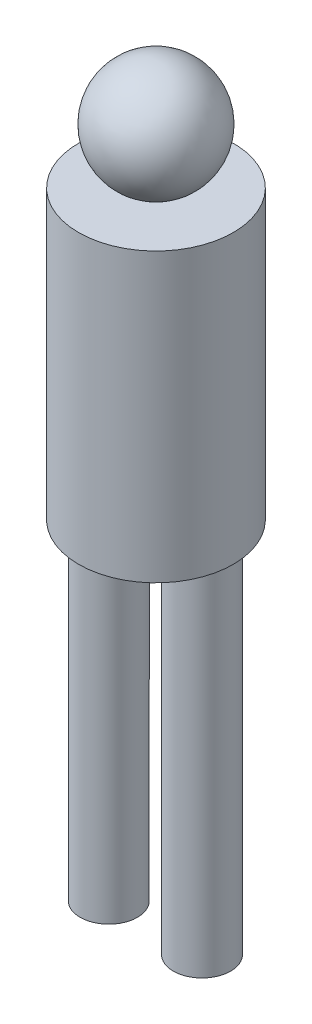
ISO-10303-21;
HEADER;
FILE_DESCRIPTION(('STEP AP214'),'2;1');
FILE_NAME('part.step','',(''),(''),'','','');
FILE_SCHEMA(('AUTOMOTIVE_DESIGN { 1 0 10303 214 1 1 1 1 }'));
ENDSEC;
DATA;
#1=APPLICATION_CONTEXT('core data for automotive mechanical design processes');
#2=APPLICATION_PROTOCOL_DEFINITION('international standard','automotive_design',2000,#1);
#3=PRODUCT_CONTEXT('',#1,'mechanical');
#4=PRODUCT('Part','Part','',(#3));
#5=PRODUCT_RELATED_PRODUCT_CATEGORY('part','',(#4));
#6=PRODUCT_DEFINITION_FORMATION('','',#4);
#7=PRODUCT_DEFINITION_CONTEXT('part definition',#1,'design');
#8=PRODUCT_DEFINITION('design','',#6,#7);
#9=PRODUCT_DEFINITION_SHAPE('','',#8);
#10=(LENGTH_UNIT() NAMED_UNIT(*) SI_UNIT(.MILLI.,.METRE.));
#11=(NAMED_UNIT(*) PLANE_ANGLE_UNIT() SI_UNIT($,.RADIAN.));
#12=(NAMED_UNIT(*) SI_UNIT($,.STERADIAN.) SOLID_ANGLE_UNIT());
#13=UNCERTAINTY_MEASURE_WITH_UNIT(LENGTH_MEASURE(1.E-05),#10,'distance_accuracy_value','');
#14=(GEOMETRIC_REPRESENTATION_CONTEXT(3) GLOBAL_UNCERTAINTY_ASSIGNED_CONTEXT((#13)) GLOBAL_UNIT_ASSIGNED_CONTEXT((#10,
#11,#12)) REPRESENTATION_CONTEXT('',''));
#15=CARTESIAN_POINT('',(0.,0.,0.));
#16=DIRECTION('',(0.,0.,1.));
#17=DIRECTION('',(1.,0.,0.));
#18=AXIS2_PLACEMENT_3D('',#15,#16,#17);
#19=CARTESIAN_POINT('',(0.,787.4,0.));
#20=DIRECTION('',(0.,-1.,0.));
#21=DIRECTION('',(0.,0.,1.));
#22=AXIS2_PLACEMENT_3D('',#19,#20,#21);
#23=SPHERICAL_SURFACE('',#22,127.);
#24=CARTESIAN_POINT('',(0.,660.4,0.));
#25=VERTEX_POINT('',#24);
#26=VERTEX_LOOP('',#25);
#27=FACE_BOUND('',#26,.T.);
#28=ADVANCED_FACE('F38',(#27),#23,.T.);
#29=CLOSED_SHELL('',(#28));
#30=MANIFOLD_SOLID_BREP('B2',#29);
#31=CARTESIAN_POINT('',(0.,0.,0.));
#32=DIRECTION('',(0.,1.,0.));
#33=DIRECTION('',(0.,0.,1.));
#34=AXIS2_PLACEMENT_3D('',#31,#32,#33);
#35=PLANE('',#34);
#36=CARTESIAN_POINT('',(-108.384656073321,0.,0.));
#37=DIRECTION('',(0.,1.,0.));
#38=DIRECTION('',(0.,0.,1.));
#39=AXIS2_PLACEMENT_3D('',#36,#37,#38);
#40=CIRCLE('',#39,65.8136172775828);
#41=CARTESIAN_POINT('',(-108.384656073321,0.,65.8136172775828));
#42=VERTEX_POINT('',#41);
#43=EDGE_CURVE('E57',#42,#42,#40,.F.);
#44=ORIENTED_EDGE('',*,*,#43,.F.);
#45=EDGE_LOOP('',(#44));
#46=FACE_BOUND('',#45,.T.);
#47=CARTESIAN_POINT('',(0.,0.,0.));
#48=DIRECTION('',(0.,1.,0.));
#49=DIRECTION('',(0.,0.,1.));
#50=AXIS2_PLACEMENT_3D('',#47,#48,#49);
#51=CIRCLE('',#50,177.8);
#52=CARTESIAN_POINT('',(0.,0.,177.8));
#53=VERTEX_POINT('',#52);
#54=EDGE_CURVE('E65',#53,#53,#51,.T.);
#55=ORIENTED_EDGE('',*,*,#54,.F.);
#56=EDGE_LOOP('',(#55));
#57=FACE_BOUND('',#56,.T.);
#58=CARTESIAN_POINT('',(105.835290588617,0.,0.));
#59=DIRECTION('',(0.,1.,0.));
#60=DIRECTION('',(0.,0.,1.));
#61=AXIS2_PLACEMENT_3D('',#58,#59,#60);
#62=CIRCLE('',#61,65.8136172775828);
#63=CARTESIAN_POINT('',(105.835290588617,0.,65.8136172775828));
#64=VERTEX_POINT('',#63);
#65=EDGE_CURVE('E37',#64,#64,#62,.F.);
#66=ORIENTED_EDGE('',*,*,#65,.F.);
#67=EDGE_LOOP('',(#66));
#68=FACE_BOUND('',#67,.T.);
#69=ADVANCED_FACE('F50',(#46,#57,#68),#35,.F.);
#70=CARTESIAN_POINT('',(0.,660.4,0.));
#71=DIRECTION('',(0.,-1.,0.));
#72=DIRECTION('',(0.,0.,-1.));
#73=AXIS2_PLACEMENT_3D('',#70,#71,#72);
#74=CYLINDRICAL_SURFACE('',#73,177.8);
#75=CARTESIAN_POINT('',(0.,660.4,0.));
#76=DIRECTION('',(0.,1.,0.));
#77=DIRECTION('',(0.,0.,1.));
#78=AXIS2_PLACEMENT_3D('',#75,#76,#77);
#79=CIRCLE('',#78,177.8);
#80=CARTESIAN_POINT('',(0.,660.4,177.8));
#81=VERTEX_POINT('',#80);
#82=EDGE_CURVE('E61',#81,#81,#79,.T.);
#83=ORIENTED_EDGE('',*,*,#82,.F.);
#84=EDGE_LOOP('',(#83));
#85=FACE_BOUND('',#84,.T.);
#86=ORIENTED_EDGE('',*,*,#54,.T.);
#87=EDGE_LOOP('',(#86));
#88=FACE_BOUND('',#87,.T.);
#89=ADVANCED_FACE('F52',(#85,#88),#74,.T.);
#90=CARTESIAN_POINT('',(0.,660.4,0.));
#91=DIRECTION('',(0.,1.,0.));
#92=DIRECTION('',(0.,0.,1.));
#93=AXIS2_PLACEMENT_3D('',#90,#91,#92);
#94=PLANE('',#93);
#95=ORIENTED_EDGE('',*,*,#82,.T.);
#96=EDGE_LOOP('',(#95));
#97=FACE_BOUND('',#96,.T.);
#98=ADVANCED_FACE('F96',(#97),#94,.T.);
#99=CARTESIAN_POINT('',(-108.384656073321,-812.8,0.));
#100=DIRECTION('',(0.,1.,0.));
#101=DIRECTION('',(0.,0.,1.));
#102=AXIS2_PLACEMENT_3D('',#99,#100,#101);
#103=CYLINDRICAL_SURFACE('',#102,65.8136172775828);
#104=CARTESIAN_POINT('',(-108.384656073321,-812.8,0.));
#105=DIRECTION('',(0.,-1.,0.));
#106=DIRECTION('',(0.,0.,-1.));
#107=AXIS2_PLACEMENT_3D('',#104,#105,#106);
#108=CIRCLE('',#107,65.8136172775828);
#109=CARTESIAN_POINT('',(-108.384656073321,-812.8,-65.8136172775828));
#110=VERTEX_POINT('',#109);
#111=EDGE_CURVE('E69',#110,#110,#108,.T.);
#112=ORIENTED_EDGE('',*,*,#111,.F.);
#113=EDGE_LOOP('',(#112));
#114=FACE_BOUND('',#113,.T.);
#115=ORIENTED_EDGE('',*,*,#43,.T.);
#116=EDGE_LOOP('',(#115));
#117=FACE_BOUND('',#116,.T.);
#118=ADVANCED_FACE('F88',(#114,#117),#103,.T.);
#119=CARTESIAN_POINT('',(-108.384656073321,-812.8,0.));
#120=DIRECTION('',(0.,-1.,0.));
#121=DIRECTION('',(0.,0.,-1.));
#122=AXIS2_PLACEMENT_3D('',#119,#120,#121);
#123=PLANE('',#122);
#124=ORIENTED_EDGE('',*,*,#111,.T.);
#125=EDGE_LOOP('',(#124));
#126=FACE_BOUND('',#125,.T.);
#127=ADVANCED_FACE('F81',(#126),#123,.T.);
#128=CARTESIAN_POINT('',(105.835290588617,-812.8,0.));
#129=DIRECTION('',(0.,1.,0.));
#130=DIRECTION('',(0.,0.,1.));
#131=AXIS2_PLACEMENT_3D('',#128,#129,#130);
#132=CYLINDRICAL_SURFACE('',#131,65.8136172775828);
#133=CARTESIAN_POINT('',(105.835290588617,-812.8,0.));
#134=DIRECTION('',(0.,-1.,0.));
#135=DIRECTION('',(0.,0.,-1.));
#136=AXIS2_PLACEMENT_3D('',#133,#134,#135);
#137=CIRCLE('',#136,65.8136172775828);
#138=CARTESIAN_POINT('',(105.835290588617,-812.8,-65.8136172775828));
#139=VERTEX_POINT('',#138);
#140=EDGE_CURVE('E73',#139,#139,#137,.T.);
#141=ORIENTED_EDGE('',*,*,#140,.F.);
#142=EDGE_LOOP('',(#141));
#143=FACE_BOUND('',#142,.T.);
#144=ORIENTED_EDGE('',*,*,#65,.T.);
#145=EDGE_LOOP('',(#144));
#146=FACE_BOUND('',#145,.T.);
#147=ADVANCED_FACE('F79',(#143,#146),#132,.T.);
#148=CARTESIAN_POINT('',(105.835290588617,-812.8,0.));
#149=DIRECTION('',(0.,-1.,0.));
#150=DIRECTION('',(0.,0.,-1.));
#151=AXIS2_PLACEMENT_3D('',#148,#149,#150);
#152=PLANE('',#151);
#153=ORIENTED_EDGE('',*,*,#140,.T.);
#154=EDGE_LOOP('',(#153));
#155=FACE_BOUND('',#154,.T.);
#156=ADVANCED_FACE('F77',(#155),#152,.T.);
#157=CLOSED_SHELL('',(#69,#89,#98,#118,#127,#147,#156));
#158=MANIFOLD_SOLID_BREP('B6',#157);
#159=ADVANCED_BREP_SHAPE_REPRESENTATION('',(#18,#30,#158),#14);
#160=SHAPE_DEFINITION_REPRESENTATION(#9,#159);
ENDSEC;
END-ISO-10303-21;
